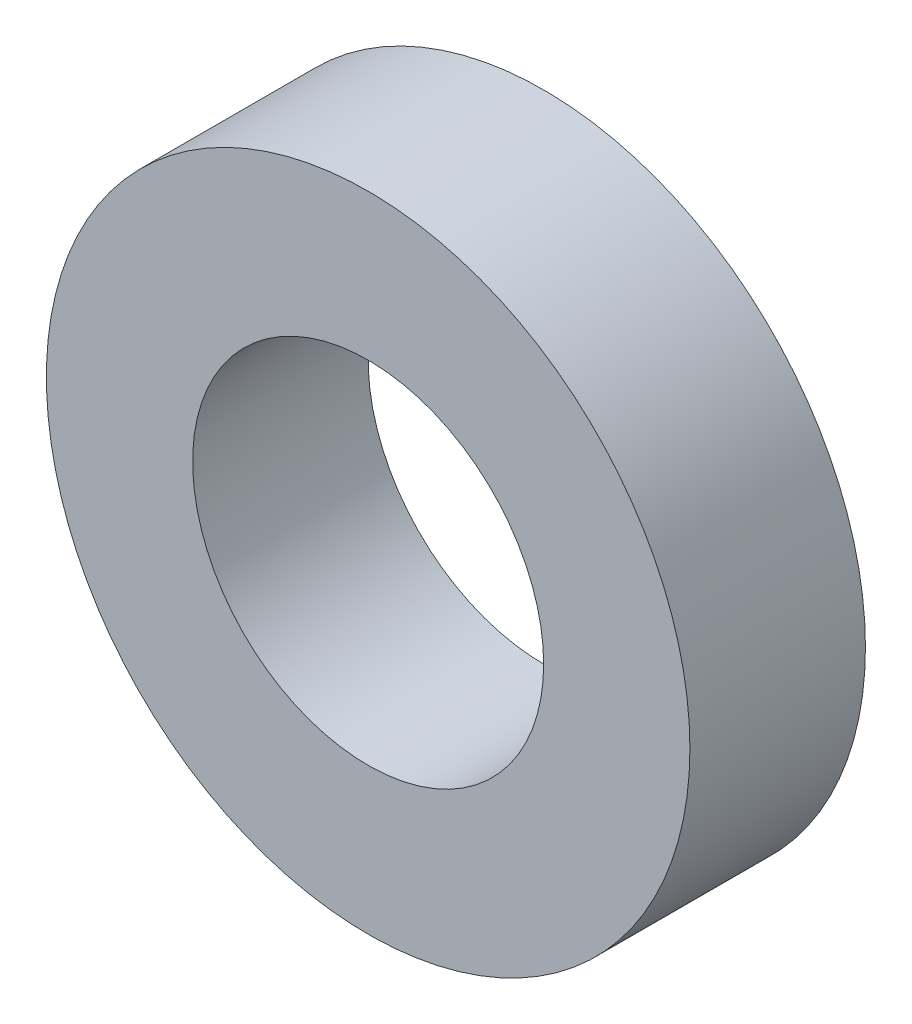
ISO-10303-21;
HEADER;
FILE_DESCRIPTION(('STEP AP214'),'2;1');
FILE_NAME('part.step','',(''),(''),'','','');
FILE_SCHEMA(('AUTOMOTIVE_DESIGN { 1 0 10303 214 1 1 1 1 }'));
ENDSEC;
DATA;
#1=APPLICATION_CONTEXT('core data for automotive mechanical design processes');
#2=APPLICATION_PROTOCOL_DEFINITION('international standard','automotive_design',2000,#1);
#3=PRODUCT_CONTEXT('',#1,'mechanical');
#4=PRODUCT('Part','Part','',(#3));
#5=PRODUCT_RELATED_PRODUCT_CATEGORY('part','',(#4));
#6=PRODUCT_DEFINITION_FORMATION('','',#4);
#7=PRODUCT_DEFINITION_CONTEXT('part definition',#1,'design');
#8=PRODUCT_DEFINITION('design','',#6,#7);
#9=PRODUCT_DEFINITION_SHAPE('','',#8);
#10=(LENGTH_UNIT() NAMED_UNIT(*) SI_UNIT(.MILLI.,.METRE.));
#11=(NAMED_UNIT(*) PLANE_ANGLE_UNIT() SI_UNIT($,.RADIAN.));
#12=(NAMED_UNIT(*) SI_UNIT($,.STERADIAN.) SOLID_ANGLE_UNIT());
#13=UNCERTAINTY_MEASURE_WITH_UNIT(LENGTH_MEASURE(1.E-05),#10,'distance_accuracy_value','');
#14=(GEOMETRIC_REPRESENTATION_CONTEXT(3) GLOBAL_UNCERTAINTY_ASSIGNED_CONTEXT((#13)) GLOBAL_UNIT_ASSIGNED_CONTEXT((#10,
#11,#12)) REPRESENTATION_CONTEXT('',''));
#15=CARTESIAN_POINT('',(0.,0.,0.));
#16=DIRECTION('',(0.,0.,1.));
#17=DIRECTION('',(1.,0.,0.));
#18=AXIS2_PLACEMENT_3D('',#15,#16,#17);
#19=CARTESIAN_POINT('',(0.,0.,3.));
#20=DIRECTION('',(0.,0.,1.));
#21=DIRECTION('',(1.,0.,0.));
#22=AXIS2_PLACEMENT_3D('',#19,#20,#21);
#23=PLANE('',#22);
#24=CARTESIAN_POINT('',(0.,0.,3.));
#25=DIRECTION('',(0.,0.,1.));
#26=DIRECTION('',(1.,0.,0.));
#27=AXIS2_PLACEMENT_3D('',#24,#25,#26);
#28=CIRCLE('',#27,5.5);
#29=CARTESIAN_POINT('',(5.5,0.,3.));
#30=VERTEX_POINT('',#29);
#31=EDGE_CURVE('E10',#30,#30,#28,.T.);
#32=ORIENTED_EDGE('',*,*,#31,.T.);
#33=EDGE_LOOP('',(#32));
#34=FACE_BOUND('',#33,.T.);
#35=CARTESIAN_POINT('',(0.,0.,3.));
#36=DIRECTION('',(0.,0.,1.));
#37=DIRECTION('',(1.,0.,0.));
#38=AXIS2_PLACEMENT_3D('',#35,#36,#37);
#39=CIRCLE('',#38,3.);
#40=CARTESIAN_POINT('',(3.,0.,3.));
#41=VERTEX_POINT('',#40);
#42=EDGE_CURVE('E42',#41,#41,#39,.T.);
#43=ORIENTED_EDGE('',*,*,#42,.F.);
#44=EDGE_LOOP('',(#43));
#45=FACE_BOUND('',#44,.T.);
#46=ADVANCED_FACE('F31',(#34,#45),#23,.T.);
#47=CARTESIAN_POINT('',(0.,0.,0.));
#48=DIRECTION('',(0.,0.,1.));
#49=DIRECTION('',(1.,0.,0.));
#50=AXIS2_PLACEMENT_3D('',#47,#48,#49);
#51=PLANE('',#50);
#52=CARTESIAN_POINT('',(0.,0.,0.));
#53=DIRECTION('',(0.,0.,1.));
#54=DIRECTION('',(1.,0.,0.));
#55=AXIS2_PLACEMENT_3D('',#52,#53,#54);
#56=CIRCLE('',#55,5.5);
#57=CARTESIAN_POINT('',(5.5,0.,0.));
#58=VERTEX_POINT('',#57);
#59=EDGE_CURVE('E35',#58,#58,#56,.T.);
#60=ORIENTED_EDGE('',*,*,#59,.F.);
#61=EDGE_LOOP('',(#60));
#62=FACE_BOUND('',#61,.T.);
#63=CARTESIAN_POINT('',(0.,0.,0.));
#64=DIRECTION('',(0.,0.,1.));
#65=DIRECTION('',(1.,0.,0.));
#66=AXIS2_PLACEMENT_3D('',#63,#64,#65);
#67=CIRCLE('',#66,3.);
#68=CARTESIAN_POINT('',(3.,0.,0.));
#69=VERTEX_POINT('',#68);
#70=EDGE_CURVE('E44',#69,#69,#67,.T.);
#71=ORIENTED_EDGE('',*,*,#70,.T.);
#72=EDGE_LOOP('',(#71));
#73=FACE_BOUND('',#72,.T.);
#74=ADVANCED_FACE('F54',(#62,#73),#51,.F.);
#75=CARTESIAN_POINT('',(0.,0.,3.));
#76=DIRECTION('',(0.,0.,-1.));
#77=DIRECTION('',(-1.,0.,0.));
#78=AXIS2_PLACEMENT_3D('',#75,#76,#77);
#79=CYLINDRICAL_SURFACE('',#78,5.5);
#80=ORIENTED_EDGE('',*,*,#31,.F.);
#81=EDGE_LOOP('',(#80));
#82=FACE_BOUND('',#81,.T.);
#83=ORIENTED_EDGE('',*,*,#59,.T.);
#84=EDGE_LOOP('',(#83));
#85=FACE_BOUND('',#84,.T.);
#86=ADVANCED_FACE('F33',(#82,#85),#79,.T.);
#87=CARTESIAN_POINT('',(0.,0.,3.));
#88=DIRECTION('',(0.,0.,-1.));
#89=DIRECTION('',(-1.,0.,0.));
#90=AXIS2_PLACEMENT_3D('',#87,#88,#89);
#91=CYLINDRICAL_SURFACE('',#90,3.);
#92=ORIENTED_EDGE('',*,*,#42,.T.);
#93=EDGE_LOOP('',(#92));
#94=FACE_BOUND('',#93,.T.);
#95=ORIENTED_EDGE('',*,*,#70,.F.);
#96=EDGE_LOOP('',(#95));
#97=FACE_BOUND('',#96,.T.);
#98=ADVANCED_FACE('F50',(#94,#97),#91,.F.);
#99=CLOSED_SHELL('',(#46,#74,#86,#98));
#100=MANIFOLD_SOLID_BREP('B2',#99);
#101=ADVANCED_BREP_SHAPE_REPRESENTATION('',(#18,#100),#14);
#102=SHAPE_DEFINITION_REPRESENTATION(#9,#101);
ENDSEC;
END-ISO-10303-21;
